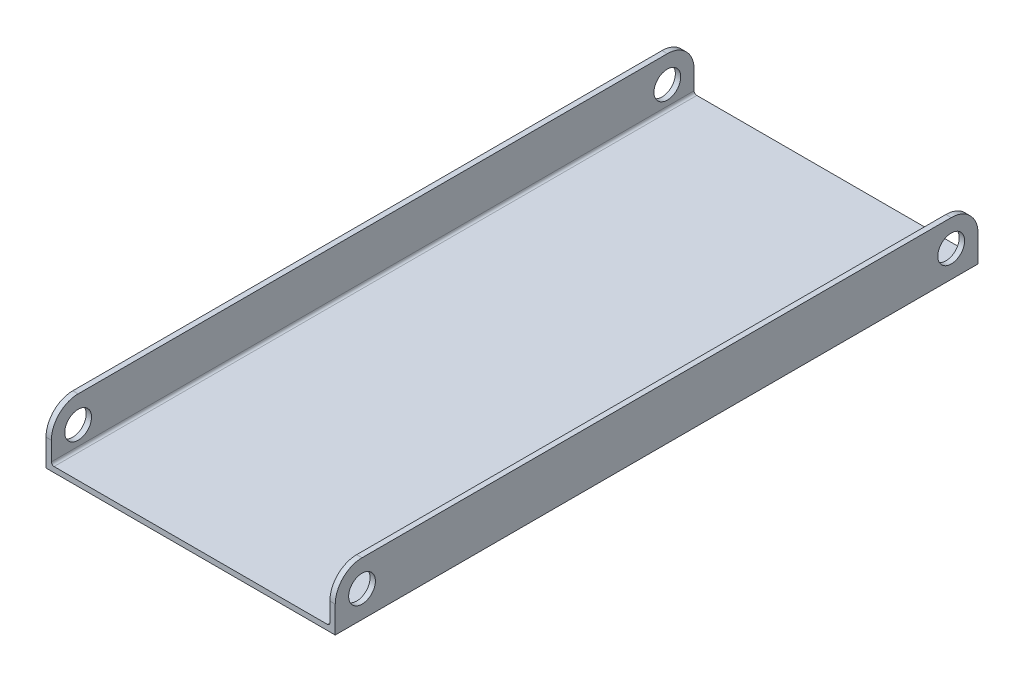
ISO-10303-21;
HEADER;
FILE_DESCRIPTION(('STEP AP214'),'2;1');
FILE_NAME('part.step','',(''),(''),'','','');
FILE_SCHEMA(('AUTOMOTIVE_DESIGN { 1 0 10303 214 1 1 1 1 }'));
ENDSEC;
DATA;
#1=APPLICATION_CONTEXT('core data for automotive mechanical design processes');
#2=APPLICATION_PROTOCOL_DEFINITION('international standard','automotive_design',2000,#1);
#3=PRODUCT_CONTEXT('',#1,'mechanical');
#4=PRODUCT('Part','Part','',(#3));
#5=PRODUCT_RELATED_PRODUCT_CATEGORY('part','',(#4));
#6=PRODUCT_DEFINITION_FORMATION('','',#4);
#7=PRODUCT_DEFINITION_CONTEXT('part definition',#1,'design');
#8=PRODUCT_DEFINITION('design','',#6,#7);
#9=PRODUCT_DEFINITION_SHAPE('','',#8);
#10=(LENGTH_UNIT() NAMED_UNIT(*) SI_UNIT(.MILLI.,.METRE.));
#11=(NAMED_UNIT(*) PLANE_ANGLE_UNIT() SI_UNIT($,.RADIAN.));
#12=(NAMED_UNIT(*) SI_UNIT($,.STERADIAN.) SOLID_ANGLE_UNIT());
#13=UNCERTAINTY_MEASURE_WITH_UNIT(LENGTH_MEASURE(1.E-05),#10,'distance_accuracy_value','');
#14=(GEOMETRIC_REPRESENTATION_CONTEXT(3) GLOBAL_UNCERTAINTY_ASSIGNED_CONTEXT((#13)) GLOBAL_UNIT_ASSIGNED_CONTEXT((#10,
#11,#12)) REPRESENTATION_CONTEXT('',''));
#15=CARTESIAN_POINT('',(0.,0.,0.));
#16=DIRECTION('',(0.,0.,1.));
#17=DIRECTION('',(1.,0.,0.));
#18=AXIS2_PLACEMENT_3D('',#15,#16,#17);
#19=CARTESIAN_POINT('',(0.,12.7,-152.4));
#20=DIRECTION('',(1.,0.,0.));
#21=DIRECTION('',(0.,1.,0.));
#22=AXIS2_PLACEMENT_3D('',#19,#20,#21);
#23=PLANE('',#22);
#24=CARTESIAN_POINT('',(0.,6.35,-6.35));
#25=DIRECTION('',(1.,0.,0.));
#26=DIRECTION('',(0.,1.,0.));
#27=AXIS2_PLACEMENT_3D('',#24,#25,#26);
#28=CIRCLE('',#27,3.175);
#29=CARTESIAN_POINT('',(0.,9.525,-6.35));
#30=VERTEX_POINT('',#29);
#31=EDGE_CURVE('E291',#30,#30,#28,.T.);
#32=ORIENTED_EDGE('',*,*,#31,.F.);
#33=EDGE_LOOP('',(#32));
#34=FACE_BOUND('',#33,.T.);
#35=CARTESIAN_POINT('',(0.,6.35,-146.05));
#36=DIRECTION('',(1.,0.,0.));
#37=DIRECTION('',(0.,1.,0.));
#38=AXIS2_PLACEMENT_3D('',#35,#36,#37);
#39=CIRCLE('',#38,3.175);
#40=CARTESIAN_POINT('',(0.,9.525,-146.05));
#41=VERTEX_POINT('',#40);
#42=EDGE_CURVE('E300',#41,#41,#39,.T.);
#43=ORIENTED_EDGE('',*,*,#42,.F.);
#44=EDGE_LOOP('',(#43));
#45=FACE_BOUND('',#44,.T.);
#46=DIRECTION('',(0.,1.,0.));
#47=VECTOR('',#46,1.);
#48=CARTESIAN_POINT('',(0.,12.7,-152.4));
#49=LINE('',#48,#47);
#50=CARTESIAN_POINT('',(0.,0.,-152.4));
#51=VERTEX_POINT('',#50);
#52=CARTESIAN_POINT('',(0.,6.35,-152.4));
#53=VERTEX_POINT('',#52);
#54=EDGE_CURVE('E176',#51,#53,#49,.T.);
#55=ORIENTED_EDGE('',*,*,#54,.T.);
#56=CARTESIAN_POINT('',(0.,6.35,-146.05));
#57=DIRECTION('',(1.,0.,0.));
#58=DIRECTION('',(0.,1.,0.));
#59=AXIS2_PLACEMENT_3D('',#56,#57,#58);
#60=CIRCLE('',#59,6.35);
#61=CARTESIAN_POINT('',(0.,12.7,-146.05));
#62=VERTEX_POINT('',#61);
#63=EDGE_CURVE('E282',#53,#62,#60,.T.);
#64=ORIENTED_EDGE('',*,*,#63,.T.);
#65=DIRECTION('',(0.,0.,1.));
#66=VECTOR('',#65,1.);
#67=CARTESIAN_POINT('',(0.,12.7,-152.4));
#68=LINE('',#67,#66);
#69=CARTESIAN_POINT('',(0.,12.7,-6.35000000000005));
#70=VERTEX_POINT('',#69);
#71=EDGE_CURVE('E178',#62,#70,#68,.T.);
#72=ORIENTED_EDGE('',*,*,#71,.T.);
#73=CARTESIAN_POINT('',(0.,6.35,-6.35));
#74=DIRECTION('',(1.,0.,0.));
#75=DIRECTION('',(0.,1.,0.));
#76=AXIS2_PLACEMENT_3D('',#73,#74,#75);
#77=CIRCLE('',#76,6.35);
#78=CARTESIAN_POINT('',(0.,6.35,0.));
#79=VERTEX_POINT('',#78);
#80=EDGE_CURVE('E61',#70,#79,#77,.T.);
#81=ORIENTED_EDGE('',*,*,#80,.T.);
#82=DIRECTION('',(0.,1.,0.));
#83=VECTOR('',#82,1.);
#84=CARTESIAN_POINT('',(0.,12.7,0.));
#85=LINE('',#84,#83);
#86=CARTESIAN_POINT('',(0.,0.,0.));
#87=VERTEX_POINT('',#86);
#88=EDGE_CURVE('E185',#87,#79,#85,.T.);
#89=ORIENTED_EDGE('',*,*,#88,.F.);
#90=DIRECTION('',(0.,0.,1.));
#91=VECTOR('',#90,1.);
#92=CARTESIAN_POINT('',(0.,0.,-152.4));
#93=LINE('',#92,#91);
#94=EDGE_CURVE('E170',#51,#87,#93,.T.);
#95=ORIENTED_EDGE('',*,*,#94,.F.);
#96=EDGE_LOOP('',(#55,#64,#72,#81,#89,#95));
#97=FACE_BOUND('',#96,.T.);
#98=ADVANCED_FACE('F43',(#34,#45,#97),#23,.T.);
#99=CARTESIAN_POINT('',(0.,0.,-152.4));
#100=DIRECTION('',(0.,-1.,0.));
#101=DIRECTION('',(0.,0.,-1.));
#102=AXIS2_PLACEMENT_3D('',#99,#100,#101);
#103=PLANE('',#102);
#104=DIRECTION('',(1.,0.,0.));
#105=VECTOR('',#104,1.);
#106=CARTESIAN_POINT('',(0.,0.,0.));
#107=LINE('',#106,#105);
#108=CARTESIAN_POINT('',(-68.58,0.,0.));
#109=VERTEX_POINT('',#108);
#110=EDGE_CURVE('E168',#109,#87,#107,.T.);
#111=ORIENTED_EDGE('',*,*,#110,.F.);
#112=DIRECTION('',(0.,0.,1.));
#113=VECTOR('',#112,1.);
#114=CARTESIAN_POINT('',(-68.58,0.,-152.4));
#115=LINE('',#114,#113);
#116=CARTESIAN_POINT('',(-68.58,0.,-152.4));
#117=VERTEX_POINT('',#116);
#118=EDGE_CURVE('E154',#117,#109,#115,.T.);
#119=ORIENTED_EDGE('',*,*,#118,.F.);
#120=DIRECTION('',(1.,0.,0.));
#121=VECTOR('',#120,1.);
#122=CARTESIAN_POINT('',(0.,0.,-152.4));
#123=LINE('',#122,#121);
#124=EDGE_CURVE('E161',#117,#51,#123,.T.);
#125=ORIENTED_EDGE('',*,*,#124,.T.);
#126=ORIENTED_EDGE('',*,*,#94,.T.);
#127=EDGE_LOOP('',(#111,#119,#125,#126));
#128=FACE_BOUND('',#127,.T.);
#129=ADVANCED_FACE('F166',(#128),#103,.T.);
#130=CARTESIAN_POINT('',(-68.58,0.,-152.4));
#131=DIRECTION('',(-1.,0.,0.));
#132=DIRECTION('',(0.,0.,1.));
#133=AXIS2_PLACEMENT_3D('',#130,#131,#132);
#134=PLANE('',#133);
#135=CARTESIAN_POINT('',(-68.58,6.35,-6.35));
#136=DIRECTION('',(-1.,0.,0.));
#137=DIRECTION('',(0.,0.,1.));
#138=AXIS2_PLACEMENT_3D('',#135,#136,#137);
#139=CIRCLE('',#138,3.175);
#140=CARTESIAN_POINT('',(-68.58,9.525,-6.35));
#141=VERTEX_POINT('',#140);
#142=EDGE_CURVE('E189',#141,#141,#139,.T.);
#143=ORIENTED_EDGE('',*,*,#142,.F.);
#144=EDGE_LOOP('',(#143));
#145=FACE_BOUND('',#144,.T.);
#146=CARTESIAN_POINT('',(-68.58,6.35,-146.05));
#147=DIRECTION('',(-1.,0.,0.));
#148=DIRECTION('',(0.,0.,1.));
#149=AXIS2_PLACEMENT_3D('',#146,#147,#148);
#150=CIRCLE('',#149,3.175);
#151=CARTESIAN_POINT('',(-68.58,9.525,-146.05));
#152=VERTEX_POINT('',#151);
#153=EDGE_CURVE('E297',#152,#152,#150,.T.);
#154=ORIENTED_EDGE('',*,*,#153,.F.);
#155=EDGE_LOOP('',(#154));
#156=FACE_BOUND('',#155,.T.);
#157=DIRECTION('',(0.,0.,1.));
#158=VECTOR('',#157,1.);
#159=CARTESIAN_POINT('',(-68.58,12.7,-152.4));
#160=LINE('',#159,#158);
#161=CARTESIAN_POINT('',(-68.58,12.7,-146.05));
#162=VERTEX_POINT('',#161);
#163=CARTESIAN_POINT('',(-68.58,12.7,-6.35000000000005));
#164=VERTEX_POINT('',#163);
#165=EDGE_CURVE('E171',#162,#164,#160,.T.);
#166=ORIENTED_EDGE('',*,*,#165,.F.);
#167=CARTESIAN_POINT('',(-68.58,6.35,-146.05));
#168=DIRECTION('',(-1.,0.,0.));
#169=DIRECTION('',(0.,0.,1.));
#170=AXIS2_PLACEMENT_3D('',#167,#168,#169);
#171=CIRCLE('',#170,6.35);
#172=CARTESIAN_POINT('',(-68.58,6.35,-152.4));
#173=VERTEX_POINT('',#172);
#174=EDGE_CURVE('E156',#162,#173,#171,.T.);
#175=ORIENTED_EDGE('',*,*,#174,.T.);
#176=DIRECTION('',(0.,-1.,0.));
#177=VECTOR('',#176,1.);
#178=CARTESIAN_POINT('',(-68.58,0.,-152.4));
#179=LINE('',#178,#177);
#180=EDGE_CURVE('E149',#173,#117,#179,.T.);
#181=ORIENTED_EDGE('',*,*,#180,.T.);
#182=ORIENTED_EDGE('',*,*,#118,.T.);
#183=DIRECTION('',(0.,-1.,0.));
#184=VECTOR('',#183,1.);
#185=CARTESIAN_POINT('',(-68.58,0.,0.));
#186=LINE('',#185,#184);
#187=CARTESIAN_POINT('',(-68.58,6.35,0.));
#188=VERTEX_POINT('',#187);
#189=EDGE_CURVE('E200',#188,#109,#186,.T.);
#190=ORIENTED_EDGE('',*,*,#189,.F.);
#191=CARTESIAN_POINT('',(-68.58,6.35,-6.35));
#192=DIRECTION('',(-1.,0.,0.));
#193=DIRECTION('',(0.,0.,1.));
#194=AXIS2_PLACEMENT_3D('',#191,#192,#193);
#195=CIRCLE('',#194,6.35);
#196=EDGE_CURVE('E251',#188,#164,#195,.T.);
#197=ORIENTED_EDGE('',*,*,#196,.T.);
#198=EDGE_LOOP('',(#166,#175,#181,#182,#190,#197));
#199=FACE_BOUND('',#198,.T.);
#200=ADVANCED_FACE('F152',(#145,#156,#199),#134,.T.);
#201=CARTESIAN_POINT('',(-68.58,12.7,-152.4));
#202=DIRECTION('',(0.,1.,0.));
#203=DIRECTION('',(0.,0.,1.));
#204=AXIS2_PLACEMENT_3D('',#201,#202,#203);
#205=PLANE('',#204);
#206=DIRECTION('',(0.,0.,1.));
#207=VECTOR('',#206,1.);
#208=CARTESIAN_POINT('',(-67.31,12.7,-152.4));
#209=LINE('',#208,#207);
#210=CARTESIAN_POINT('',(-67.31,12.7,-146.05));
#211=VERTEX_POINT('',#210);
#212=CARTESIAN_POINT('',(-67.31,12.7,-6.35000000000005));
#213=VERTEX_POINT('',#212);
#214=EDGE_CURVE('E211',#211,#213,#209,.T.);
#215=ORIENTED_EDGE('',*,*,#214,.F.);
#216=DIRECTION('',(-1.,0.,0.));
#217=VECTOR('',#216,1.);
#218=CARTESIAN_POINT('',(-68.58,12.7,-146.05));
#219=LINE('',#218,#217);
#220=EDGE_CURVE('E247',#211,#162,#219,.T.);
#221=ORIENTED_EDGE('',*,*,#220,.T.);
#222=ORIENTED_EDGE('',*,*,#165,.T.);
#223=DIRECTION('',(-1.,0.,0.));
#224=VECTOR('',#223,1.);
#225=CARTESIAN_POINT('',(-67.31,12.7,-6.35));
#226=LINE('',#225,#224);
#227=EDGE_CURVE('E244',#164,#213,#226,.F.);
#228=ORIENTED_EDGE('',*,*,#227,.T.);
#229=EDGE_LOOP('',(#215,#221,#222,#228));
#230=FACE_BOUND('',#229,.T.);
#231=ADVANCED_FACE('F340',(#230),#205,.T.);
#232=CARTESIAN_POINT('',(-67.31,12.7,-152.4));
#233=DIRECTION('',(1.,0.,0.));
#234=DIRECTION('',(0.,0.,-1.));
#235=AXIS2_PLACEMENT_3D('',#232,#233,#234);
#236=PLANE('',#235);
#237=CARTESIAN_POINT('',(-67.31,6.35,-6.35));
#238=DIRECTION('',(1.,0.,0.));
#239=DIRECTION('',(0.,0.,-1.));
#240=AXIS2_PLACEMENT_3D('',#237,#238,#239);
#241=CIRCLE('',#240,3.175);
#242=CARTESIAN_POINT('',(-67.31,9.525,-6.35));
#243=VERTEX_POINT('',#242);
#244=EDGE_CURVE('E311',#243,#243,#241,.T.);
#245=ORIENTED_EDGE('',*,*,#244,.F.);
#246=EDGE_LOOP('',(#245));
#247=FACE_BOUND('',#246,.T.);
#248=CARTESIAN_POINT('',(-67.31,6.35,-146.05));
#249=DIRECTION('',(1.,0.,0.));
#250=DIRECTION('',(0.,0.,-1.));
#251=AXIS2_PLACEMENT_3D('',#248,#249,#250);
#252=CIRCLE('',#251,3.175);
#253=CARTESIAN_POINT('',(-67.31,9.525,-146.05));
#254=VERTEX_POINT('',#253);
#255=EDGE_CURVE('E290',#254,#254,#252,.T.);
#256=ORIENTED_EDGE('',*,*,#255,.F.);
#257=EDGE_LOOP('',(#256));
#258=FACE_BOUND('',#257,.T.);
#259=DIRECTION('',(0.,1.,0.));
#260=VECTOR('',#259,1.);
#261=CARTESIAN_POINT('',(-67.31,12.7,-152.4));
#262=LINE('',#261,#260);
#263=CARTESIAN_POINT('',(-67.31,1.90499999999999,-152.4));
#264=VERTEX_POINT('',#263);
#265=CARTESIAN_POINT('',(-67.31,6.35,-152.4));
#266=VERTEX_POINT('',#265);
#267=EDGE_CURVE('E162',#264,#266,#262,.T.);
#268=ORIENTED_EDGE('',*,*,#267,.T.);
#269=CARTESIAN_POINT('',(-67.31,6.35,-146.05));
#270=DIRECTION('',(1.,0.,0.));
#271=DIRECTION('',(0.,0.,-1.));
#272=AXIS2_PLACEMENT_3D('',#269,#270,#271);
#273=CIRCLE('',#272,6.35);
#274=EDGE_CURVE('E265',#266,#211,#273,.T.);
#275=ORIENTED_EDGE('',*,*,#274,.T.);
#276=ORIENTED_EDGE('',*,*,#214,.T.);
#277=CARTESIAN_POINT('',(-67.31,6.35,-6.35));
#278=DIRECTION('',(1.,0.,0.));
#279=DIRECTION('',(0.,0.,-1.));
#280=AXIS2_PLACEMENT_3D('',#277,#278,#279);
#281=CIRCLE('',#280,6.35);
#282=CARTESIAN_POINT('',(-67.31,6.35,0.));
#283=VERTEX_POINT('',#282);
#284=EDGE_CURVE('E262',#213,#283,#281,.T.);
#285=ORIENTED_EDGE('',*,*,#284,.T.);
#286=DIRECTION('',(0.,1.,0.));
#287=VECTOR('',#286,1.);
#288=CARTESIAN_POINT('',(-67.31,12.7,0.));
#289=LINE('',#288,#287);
#290=CARTESIAN_POINT('',(-67.31,1.90499999999999,0.));
#291=VERTEX_POINT('',#290);
#292=EDGE_CURVE('E196',#291,#283,#289,.T.);
#293=ORIENTED_EDGE('',*,*,#292,.F.);
#294=DIRECTION('',(0.,0.,1.));
#295=VECTOR('',#294,1.);
#296=CARTESIAN_POINT('',(-67.31,1.90499999999999,-152.4));
#297=LINE('',#296,#295);
#298=EDGE_CURVE('E228',#291,#264,#297,.F.);
#299=ORIENTED_EDGE('',*,*,#298,.T.);
#300=EDGE_LOOP('',(#268,#275,#276,#285,#293,#299));
#301=FACE_BOUND('',#300,.T.);
#302=ADVANCED_FACE('F331',(#247,#258,#301),#236,.T.);
#303=CARTESIAN_POINT('',(-67.31,1.26999999999999,-152.4));
#304=DIRECTION('',(0.,1.,0.));
#305=DIRECTION('',(0.,0.,1.));
#306=AXIS2_PLACEMENT_3D('',#303,#304,#305);
#307=PLANE('',#306);
#308=DIRECTION('',(-1.,0.,0.));
#309=VECTOR('',#308,1.);
#310=CARTESIAN_POINT('',(-67.31,1.26999999999999,0.));
#311=LINE('',#310,#309);
#312=CARTESIAN_POINT('',(-1.90499999999999,1.26999999999999,0.));
#313=VERTEX_POINT('',#312);
#314=CARTESIAN_POINT('',(-66.675,1.26999999999999,0.));
#315=VERTEX_POINT('',#314);
#316=EDGE_CURVE('E192',#313,#315,#311,.T.);
#317=ORIENTED_EDGE('',*,*,#316,.F.);
#318=DIRECTION('',(0.,0.,1.));
#319=VECTOR('',#318,1.);
#320=CARTESIAN_POINT('',(-1.90499999999999,1.26999999999999,-152.4));
#321=LINE('',#320,#319);
#322=CARTESIAN_POINT('',(-1.90499999999999,1.26999999999999,-152.4));
#323=VERTEX_POINT('',#322);
#324=EDGE_CURVE('E225',#313,#323,#321,.F.);
#325=ORIENTED_EDGE('',*,*,#324,.T.);
#326=DIRECTION('',(-1.,0.,0.));
#327=VECTOR('',#326,1.);
#328=CARTESIAN_POINT('',(-67.31,1.26999999999999,-152.4));
#329=LINE('',#328,#327);
#330=CARTESIAN_POINT('',(-66.675,1.26999999999999,-152.4));
#331=VERTEX_POINT('',#330);
#332=EDGE_CURVE('E323',#323,#331,#329,.T.);
#333=ORIENTED_EDGE('',*,*,#332,.T.);
#334=DIRECTION('',(0.,0.,1.));
#335=VECTOR('',#334,1.);
#336=CARTESIAN_POINT('',(-66.675,1.26999999999999,0.));
#337=LINE('',#336,#335);
#338=EDGE_CURVE('E221',#331,#315,#337,.T.);
#339=ORIENTED_EDGE('',*,*,#338,.T.);
#340=EDGE_LOOP('',(#317,#325,#333,#339));
#341=FACE_BOUND('',#340,.T.);
#342=ADVANCED_FACE('F354',(#341),#307,.T.);
#343=CARTESIAN_POINT('',(-1.26999999999999,1.26999999999999,-152.4));
#344=DIRECTION('',(-1.,0.,0.));
#345=DIRECTION('',(0.,0.,1.));
#346=AXIS2_PLACEMENT_3D('',#343,#344,#345);
#347=PLANE('',#346);
#348=CARTESIAN_POINT('',(-1.27000000000002,6.35,-6.35));
#349=DIRECTION('',(-1.,0.,0.));
#350=DIRECTION('',(0.,0.,1.));
#351=AXIS2_PLACEMENT_3D('',#348,#349,#350);
#352=CIRCLE('',#351,3.175);
#353=CARTESIAN_POINT('',(-1.26999999999999,9.525,-6.35));
#354=VERTEX_POINT('',#353);
#355=EDGE_CURVE('E47',#354,#354,#352,.T.);
#356=ORIENTED_EDGE('',*,*,#355,.F.);
#357=EDGE_LOOP('',(#356));
#358=FACE_BOUND('',#357,.T.);
#359=CARTESIAN_POINT('',(-1.27000000000002,6.35,-146.05));
#360=DIRECTION('',(-1.,0.,0.));
#361=DIRECTION('',(0.,0.,1.));
#362=AXIS2_PLACEMENT_3D('',#359,#360,#361);
#363=CIRCLE('',#362,3.175);
#364=CARTESIAN_POINT('',(-1.26999999999999,9.525,-146.05));
#365=VERTEX_POINT('',#364);
#366=EDGE_CURVE('E287',#365,#365,#363,.T.);
#367=ORIENTED_EDGE('',*,*,#366,.F.);
#368=EDGE_LOOP('',(#367));
#369=FACE_BOUND('',#368,.T.);
#370=DIRECTION('',(0.,0.,1.));
#371=VECTOR('',#370,1.);
#372=CARTESIAN_POINT('',(-1.26999999999999,12.7,-152.4));
#373=LINE('',#372,#371);
#374=CARTESIAN_POINT('',(-1.26999999999999,12.7,-146.05));
#375=VERTEX_POINT('',#374);
#376=CARTESIAN_POINT('',(-1.26999999999999,12.7,-6.35000000000005));
#377=VERTEX_POINT('',#376);
#378=EDGE_CURVE('E181',#375,#377,#373,.T.);
#379=ORIENTED_EDGE('',*,*,#378,.F.);
#380=CARTESIAN_POINT('',(-1.26999999999999,6.35,-146.05));
#381=DIRECTION('',(-1.,0.,0.));
#382=DIRECTION('',(0.,0.,1.));
#383=AXIS2_PLACEMENT_3D('',#380,#381,#382);
#384=CIRCLE('',#383,6.35);
#385=CARTESIAN_POINT('',(-1.26999999999999,6.35,-152.4));
#386=VERTEX_POINT('',#385);
#387=EDGE_CURVE('E277',#375,#386,#384,.T.);
#388=ORIENTED_EDGE('',*,*,#387,.T.);
#389=DIRECTION('',(0.,-1.,0.));
#390=VECTOR('',#389,1.);
#391=CARTESIAN_POINT('',(-1.26999999999999,1.26999999999999,-152.4));
#392=LINE('',#391,#390);
#393=CARTESIAN_POINT('',(-1.26999999999999,1.90499999999999,-152.4));
#394=VERTEX_POINT('',#393);
#395=EDGE_CURVE('E320',#386,#394,#392,.T.);
#396=ORIENTED_EDGE('',*,*,#395,.T.);
#397=DIRECTION('',(0.,0.,1.));
#398=VECTOR('',#397,1.);
#399=CARTESIAN_POINT('',(-1.26999999999999,1.90499999999999,0.));
#400=LINE('',#399,#398);
#401=CARTESIAN_POINT('',(-1.26999999999999,1.90499999999999,0.));
#402=VERTEX_POINT('',#401);
#403=EDGE_CURVE('E206',#394,#402,#400,.T.);
#404=ORIENTED_EDGE('',*,*,#403,.T.);
#405=DIRECTION('',(0.,-1.,0.));
#406=VECTOR('',#405,1.);
#407=CARTESIAN_POINT('',(-1.26999999999999,1.26999999999999,0.));
#408=LINE('',#407,#406);
#409=CARTESIAN_POINT('',(-1.26999999999999,6.35,0.));
#410=VERTEX_POINT('',#409);
#411=EDGE_CURVE('E188',#410,#402,#408,.T.);
#412=ORIENTED_EDGE('',*,*,#411,.F.);
#413=CARTESIAN_POINT('',(-1.26999999999999,6.35,-6.35));
#414=DIRECTION('',(-1.,0.,0.));
#415=DIRECTION('',(0.,0.,1.));
#416=AXIS2_PLACEMENT_3D('',#413,#414,#415);
#417=CIRCLE('',#416,6.35);
#418=EDGE_CURVE('E69',#410,#377,#417,.T.);
#419=ORIENTED_EDGE('',*,*,#418,.T.);
#420=EDGE_LOOP('',(#379,#388,#396,#404,#412,#419));
#421=FACE_BOUND('',#420,.T.);
#422=ADVANCED_FACE('F373',(#358,#369,#421),#347,.T.);
#423=CARTESIAN_POINT('',(-1.26999999999999,12.7,-152.4));
#424=DIRECTION('',(0.,1.,0.));
#425=DIRECTION('',(0.,0.,1.));
#426=AXIS2_PLACEMENT_3D('',#423,#424,#425);
#427=PLANE('',#426);
#428=ORIENTED_EDGE('',*,*,#71,.F.);
#429=DIRECTION('',(-1.,0.,0.));
#430=VECTOR('',#429,1.);
#431=CARTESIAN_POINT('',(-1.26999999999999,12.7,-146.05));
#432=LINE('',#431,#430);
#433=EDGE_CURVE('E271',#62,#375,#432,.T.);
#434=ORIENTED_EDGE('',*,*,#433,.T.);
#435=ORIENTED_EDGE('',*,*,#378,.T.);
#436=DIRECTION('',(-1.,0.,0.));
#437=VECTOR('',#436,1.);
#438=CARTESIAN_POINT('',(0.,12.7,-6.35));
#439=LINE('',#438,#437);
#440=EDGE_CURVE('E268',#377,#70,#439,.F.);
#441=ORIENTED_EDGE('',*,*,#440,.T.);
#442=EDGE_LOOP('',(#428,#434,#435,#441));
#443=FACE_BOUND('',#442,.T.);
#444=ADVANCED_FACE('F369',(#443),#427,.T.);
#445=CARTESIAN_POINT('',(0.,0.,-152.4));
#446=DIRECTION('',(0.,0.,-1.));
#447=DIRECTION('',(-1.,0.,0.));
#448=AXIS2_PLACEMENT_3D('',#445,#446,#447);
#449=PLANE('',#448);
#450=ORIENTED_EDGE('',*,*,#180,.F.);
#451=DIRECTION('',(-1.,0.,0.));
#452=VECTOR('',#451,1.);
#453=CARTESIAN_POINT('',(0.,6.35,-152.4));
#454=LINE('',#453,#452);
#455=EDGE_CURVE('E259',#173,#266,#454,.F.);
#456=ORIENTED_EDGE('',*,*,#455,.T.);
#457=ORIENTED_EDGE('',*,*,#267,.F.);
#458=CARTESIAN_POINT('',(-66.675,1.90499999999999,-152.4));
#459=DIRECTION('',(0.,0.,-1.));
#460=DIRECTION('',(-1.,0.,0.));
#461=AXIS2_PLACEMENT_3D('',#458,#459,#460);
#462=CIRCLE('',#461,0.635);
#463=EDGE_CURVE('E241',#264,#331,#462,.F.);
#464=ORIENTED_EDGE('',*,*,#463,.T.);
#465=ORIENTED_EDGE('',*,*,#332,.F.);
#466=CARTESIAN_POINT('',(-1.90499999999999,1.90499999999999,-152.4));
#467=DIRECTION('',(0.,0.,-1.));
#468=DIRECTION('',(-1.,0.,0.));
#469=AXIS2_PLACEMENT_3D('',#466,#467,#468);
#470=CIRCLE('',#469,0.635);
#471=EDGE_CURVE('E234',#323,#394,#470,.F.);
#472=ORIENTED_EDGE('',*,*,#471,.T.);
#473=ORIENTED_EDGE('',*,*,#395,.F.);
#474=DIRECTION('',(-1.,0.,0.));
#475=VECTOR('',#474,1.);
#476=CARTESIAN_POINT('',(0.,6.35,-152.4));
#477=LINE('',#476,#475);
#478=EDGE_CURVE('E256',#386,#53,#477,.F.);
#479=ORIENTED_EDGE('',*,*,#478,.T.);
#480=ORIENTED_EDGE('',*,*,#54,.F.);
#481=ORIENTED_EDGE('',*,*,#124,.F.);
#482=EDGE_LOOP('',(#450,#456,#457,#464,#465,#472,#473,#479,#480,#481));
#483=FACE_BOUND('',#482,.T.);
#484=ADVANCED_FACE('F174',(#483),#449,.T.);
#485=CARTESIAN_POINT('',(0.,0.,0.));
#486=DIRECTION('',(0.,0.,-1.));
#487=DIRECTION('',(-1.,0.,0.));
#488=AXIS2_PLACEMENT_3D('',#485,#486,#487);
#489=PLANE('',#488);
#490=ORIENTED_EDGE('',*,*,#88,.T.);
#491=DIRECTION('',(-1.,0.,0.));
#492=VECTOR('',#491,1.);
#493=CARTESIAN_POINT('',(-1.26999999999999,6.35,0.));
#494=LINE('',#493,#492);
#495=EDGE_CURVE('E11',#79,#410,#494,.T.);
#496=ORIENTED_EDGE('',*,*,#495,.T.);
#497=ORIENTED_EDGE('',*,*,#411,.T.);
#498=CARTESIAN_POINT('',(-1.90499999999999,1.90499999999999,0.));
#499=DIRECTION('',(0.,0.,-1.));
#500=DIRECTION('',(-1.,0.,0.));
#501=AXIS2_PLACEMENT_3D('',#498,#499,#500);
#502=CIRCLE('',#501,0.635);
#503=EDGE_CURVE('E231',#402,#313,#502,.T.);
#504=ORIENTED_EDGE('',*,*,#503,.T.);
#505=ORIENTED_EDGE('',*,*,#316,.T.);
#506=CARTESIAN_POINT('',(-66.675,1.90499999999999,0.));
#507=DIRECTION('',(0.,0.,-1.));
#508=DIRECTION('',(-1.,0.,0.));
#509=AXIS2_PLACEMENT_3D('',#506,#507,#508);
#510=CIRCLE('',#509,0.635);
#511=EDGE_CURVE('E238',#315,#291,#510,.T.);
#512=ORIENTED_EDGE('',*,*,#511,.T.);
#513=ORIENTED_EDGE('',*,*,#292,.T.);
#514=DIRECTION('',(-1.,0.,0.));
#515=VECTOR('',#514,1.);
#516=CARTESIAN_POINT('',(-68.58,6.35,0.));
#517=LINE('',#516,#515);
#518=EDGE_CURVE('E53',#283,#188,#517,.T.);
#519=ORIENTED_EDGE('',*,*,#518,.T.);
#520=ORIENTED_EDGE('',*,*,#189,.T.);
#521=ORIENTED_EDGE('',*,*,#110,.T.);
#522=EDGE_LOOP('',(#490,#496,#497,#504,#505,#512,#513,#519,#520,#521));
#523=FACE_BOUND('',#522,.T.);
#524=ADVANCED_FACE('F346',(#523),#489,.F.);
#525=CARTESIAN_POINT('',(-1.90499999999999,1.90499999999999,-152.4));
#526=DIRECTION('',(0.,0.,-1.));
#527=DIRECTION('',(-1.,0.,0.));
#528=AXIS2_PLACEMENT_3D('',#525,#526,#527);
#529=CYLINDRICAL_SURFACE('',#528,0.635);
#530=ORIENTED_EDGE('',*,*,#471,.F.);
#531=ORIENTED_EDGE('',*,*,#324,.F.);
#532=ORIENTED_EDGE('',*,*,#503,.F.);
#533=ORIENTED_EDGE('',*,*,#403,.F.);
#534=EDGE_LOOP('',(#530,#531,#532,#533));
#535=FACE_BOUND('',#534,.T.);
#536=ADVANCED_FACE('F358',(#535),#529,.F.);
#537=CARTESIAN_POINT('',(-66.675,1.90499999999999,-152.4));
#538=DIRECTION('',(0.,0.,-1.));
#539=DIRECTION('',(-1.,0.,0.));
#540=AXIS2_PLACEMENT_3D('',#537,#538,#539);
#541=CYLINDRICAL_SURFACE('',#540,0.635);
#542=ORIENTED_EDGE('',*,*,#463,.F.);
#543=ORIENTED_EDGE('',*,*,#298,.F.);
#544=ORIENTED_EDGE('',*,*,#511,.F.);
#545=ORIENTED_EDGE('',*,*,#338,.F.);
#546=EDGE_LOOP('',(#542,#543,#544,#545));
#547=FACE_BOUND('',#546,.T.);
#548=ADVANCED_FACE('F348',(#547),#541,.F.);
#549=CARTESIAN_POINT('',(-68.58,6.35,-146.05));
#550=DIRECTION('',(-1.,0.,0.));
#551=DIRECTION('',(0.,0.,1.));
#552=AXIS2_PLACEMENT_3D('',#549,#550,#551);
#553=CYLINDRICAL_SURFACE('',#552,6.35);
#554=ORIENTED_EDGE('',*,*,#274,.F.);
#555=ORIENTED_EDGE('',*,*,#455,.F.);
#556=ORIENTED_EDGE('',*,*,#174,.F.);
#557=ORIENTED_EDGE('',*,*,#220,.F.);
#558=EDGE_LOOP('',(#554,#555,#556,#557));
#559=FACE_BOUND('',#558,.T.);
#560=ADVANCED_FACE('F338',(#559),#553,.T.);
#561=CARTESIAN_POINT('',(-1.26999999999999,6.35,-146.05));
#562=DIRECTION('',(-1.,0.,0.));
#563=DIRECTION('',(0.,0.,1.));
#564=AXIS2_PLACEMENT_3D('',#561,#562,#563);
#565=CYLINDRICAL_SURFACE('',#564,6.35);
#566=ORIENTED_EDGE('',*,*,#63,.F.);
#567=ORIENTED_EDGE('',*,*,#478,.F.);
#568=ORIENTED_EDGE('',*,*,#387,.F.);
#569=ORIENTED_EDGE('',*,*,#433,.F.);
#570=EDGE_LOOP('',(#566,#567,#568,#569));
#571=FACE_BOUND('',#570,.T.);
#572=ADVANCED_FACE('F365',(#571),#565,.T.);
#573=CARTESIAN_POINT('',(0.,6.35,-6.35));
#574=DIRECTION('',(1.,0.,0.));
#575=DIRECTION('',(0.,0.,-1.));
#576=AXIS2_PLACEMENT_3D('',#573,#574,#575);
#577=CYLINDRICAL_SURFACE('',#576,6.35);
#578=ORIENTED_EDGE('',*,*,#80,.F.);
#579=ORIENTED_EDGE('',*,*,#440,.F.);
#580=ORIENTED_EDGE('',*,*,#418,.F.);
#581=ORIENTED_EDGE('',*,*,#495,.F.);
#582=EDGE_LOOP('',(#578,#579,#580,#581));
#583=FACE_BOUND('',#582,.T.);
#584=ADVANCED_FACE('F371',(#583),#577,.T.);
#585=CARTESIAN_POINT('',(0.,6.35,-6.35));
#586=DIRECTION('',(1.,0.,0.));
#587=DIRECTION('',(0.,0.,-1.));
#588=AXIS2_PLACEMENT_3D('',#585,#586,#587);
#589=CYLINDRICAL_SURFACE('',#588,6.35);
#590=ORIENTED_EDGE('',*,*,#284,.F.);
#591=ORIENTED_EDGE('',*,*,#227,.F.);
#592=ORIENTED_EDGE('',*,*,#196,.F.);
#593=ORIENTED_EDGE('',*,*,#518,.F.);
#594=EDGE_LOOP('',(#590,#591,#592,#593));
#595=FACE_BOUND('',#594,.T.);
#596=ADVANCED_FACE('F45',(#595),#589,.T.);
#597=CARTESIAN_POINT('',(-152.4,6.34999999999999,-146.05));
#598=DIRECTION('',(1.,0.,0.));
#599=DIRECTION('',(0.,1.,0.));
#600=AXIS2_PLACEMENT_3D('',#597,#598,#599);
#601=CYLINDRICAL_SURFACE('',#600,3.175);
#602=CARTESIAN_POINT('',(-1.26999999999999,9.525,-146.05));
#603=CARTESIAN_POINT('',(-1.25677083333333,9.525,-146.05));
#604=CARTESIAN_POINT('',(-1.24354166666666,9.525,-146.05));
#605=CARTESIAN_POINT('',(-1.21708333333333,9.525,-146.05));
#606=CARTESIAN_POINT('',(-1.20385416666667,9.525,-146.05));
#607=CARTESIAN_POINT('',(-1.17739583333334,9.525,-146.05));
#608=CARTESIAN_POINT('',(-1.16416666666667,9.525,-146.05));
#609=CARTESIAN_POINT('',(-1.13770833333334,9.525,-146.05));
#610=CARTESIAN_POINT('',(-1.12447916666667,9.525,-146.05));
#611=CARTESIAN_POINT('',(-1.09802083333333,9.525,-146.05));
#612=CARTESIAN_POINT('',(-1.08479166666666,9.525,-146.05));
#613=CARTESIAN_POINT('',(-1.05833333333332,9.525,-146.05));
#614=CARTESIAN_POINT('',(-1.04510416666665,9.525,-146.05));
#615=CARTESIAN_POINT('',(-1.01864583333332,9.525,-146.05));
#616=CARTESIAN_POINT('',(-1.00541666666666,9.525,-146.05));
#617=CARTESIAN_POINT('',(-0.978958333333326,9.525,-146.05));
#618=CARTESIAN_POINT('',(-0.96572916666666,9.525,-146.05));
#619=CARTESIAN_POINT('',(-0.93927083333333,9.525,-146.05));
#620=CARTESIAN_POINT('',(-0.926041666666664,9.525,-146.05));
#621=CARTESIAN_POINT('',(-0.899583333333333,9.525,-146.05));
#622=CARTESIAN_POINT('',(-0.886354166666668,9.525,-146.05));
#623=CARTESIAN_POINT('',(-0.859895833333337,9.525,-146.05));
#624=CARTESIAN_POINT('',(-0.846666666666671,9.525,-146.05));
#625=CARTESIAN_POINT('',(-0.820208333333331,9.525,-146.05));
#626=CARTESIAN_POINT('',(-0.806979166666657,9.525,-146.05));
#627=CARTESIAN_POINT('',(-0.780520833333317,9.525,-146.05));
#628=CARTESIAN_POINT('',(-0.767291666666651,9.525,-146.05));
#629=CARTESIAN_POINT('',(-0.74083333333332,9.525,-146.05));
#630=CARTESIAN_POINT('',(-0.727604166666655,9.525,-146.05));
#631=CARTESIAN_POINT('',(-0.701145833333324,9.525,-146.05));
#632=CARTESIAN_POINT('',(-0.687916666666658,9.525,-146.05));
#633=CARTESIAN_POINT('',(-0.661458333333328,9.525,-146.05));
#634=CARTESIAN_POINT('',(-0.648229166666662,9.525,-146.05));
#635=CARTESIAN_POINT('',(-0.621770833333331,9.525,-146.05));
#636=CARTESIAN_POINT('',(-0.608541666666666,9.525,-146.05));
#637=CARTESIAN_POINT('',(-0.582083333333335,9.525,-146.05));
#638=CARTESIAN_POINT('',(-0.568854166666669,9.525,-146.05));
#639=CARTESIAN_POINT('',(-0.542395833333339,9.525,-146.05));
#640=CARTESIAN_POINT('',(-0.529166666666673,9.525,-146.05));
#641=CARTESIAN_POINT('',(-0.502708333333342,9.525,-146.05));
#642=CARTESIAN_POINT('',(-0.489479166666677,9.525,-146.05));
#643=CARTESIAN_POINT('',(-0.463020833333337,9.525,-146.05));
#644=CARTESIAN_POINT('',(-0.449791666666662,9.525,-146.05));
#645=CARTESIAN_POINT('',(-0.423333333333322,9.525,-146.05));
#646=CARTESIAN_POINT('',(-0.410104166666656,9.525,-146.05));
#647=CARTESIAN_POINT('',(-0.383645833333326,9.525,-146.05));
#648=CARTESIAN_POINT('',(-0.37041666666666,9.525,-146.05));
#649=CARTESIAN_POINT('',(-0.343958333333329,9.525,-146.05));
#650=CARTESIAN_POINT('',(-0.330729166666664,9.525,-146.05));
#651=CARTESIAN_POINT('',(-0.304270833333333,9.525,-146.05));
#652=CARTESIAN_POINT('',(-0.291041666666667,9.525,-146.05));
#653=CARTESIAN_POINT('',(-0.264583333333337,9.525,-146.05));
#654=CARTESIAN_POINT('',(-0.251354166666671,9.525,-146.05));
#655=CARTESIAN_POINT('',(-0.22489583333334,9.525,-146.05));
#656=CARTESIAN_POINT('',(-0.211666666666675,9.525,-146.05));
#657=CARTESIAN_POINT('',(-0.185208333333335,9.525,-146.05));
#658=CARTESIAN_POINT('',(-0.17197916666666,9.525,-146.05));
#659=CARTESIAN_POINT('',(-0.14552083333332,9.525,-146.05));
#660=CARTESIAN_POINT('',(-0.132291666666654,9.525,-146.05));
#661=CARTESIAN_POINT('',(-0.105833333333324,9.525,-146.05));
#662=CARTESIAN_POINT('',(-0.0926041666666581,9.525,-146.05));
#663=CARTESIAN_POINT('',(-0.0661458333333272,9.525,-146.05));
#664=CARTESIAN_POINT('',(-0.0529166666666618,9.525,-146.05));
#665=CARTESIAN_POINT('',(-0.0264583333333309,9.525,-146.05));
#666=CARTESIAN_POINT('',(-0.0132291666666655,9.525,-146.05));
#667=CARTESIAN_POINT('',(0.,9.525,-146.05));
#668=B_SPLINE_CURVE_WITH_KNOTS('',3,(#602,#603,#604,#605,#606,#607,#608,#609,#610,#611,#612,
#613,#614,#615,#616,#617,#618,#619,#620,#621,#622,#623,#624,#625,#626,#627,#628,#629,#630,#631,
#632,#633,#634,#635,#636,#637,#638,#639,#640,#641,#642,#643,#644,#645,#646,#647,#648,#649,#650,
#651,#652,#653,#654,#655,#656,#657,#658,#659,#660,#661,#662,#663,#664,#665,#666,#667),
.UNSPECIFIED.,.F.,.F.,(4,2,2,2,2,2,2,2,2,2,2,2,2,2,2,2,2,2,2,2,2,2,2,2,2,2,2,2,2,2,2,2,4),(0.,
0.0396874999999963,0.0793749999999926,0.119062499999989,0.158749999999985,0.198437500000009,
0.238125000000006,0.277812500000002,0.317499999999998,0.357187499999995,0.396874999999991,
0.436562499999987,0.476250000000011,0.515937500000008,0.555625000000004,0.5953125,
0.634999999999997,0.674687499999993,0.714374999999989,0.754062499999986,0.793749999999982,
0.833437500000006,0.873125000000002,0.912812499999999,0.952499999999995,0.992187499999991,
1.03187499999999,1.07156249999998,1.11125000000001,1.1509375,1.190625,1.2303125,
1.26999999999999),.UNSPECIFIED.);
#669=EDGE_CURVE('BSEAM405',#365,#41,#668,.T.);
#670=ORIENTED_EDGE('',*,*,#366,.T.);
#671=ORIENTED_EDGE('',*,*,#42,.T.);
#672=ORIENTED_EDGE('',*,*,#669,.T.);
#673=ORIENTED_EDGE('',*,*,#669,.F.);
#674=EDGE_LOOP('',(#670,#672,#671,#673));
#675=FACE_BOUND('',#674,.T.);
#676=ADVANCED_FACE('F405',(#675),#601,.F.);
#677=CARTESIAN_POINT('',(-152.4,6.34999999999999,-6.35));
#678=DIRECTION('',(1.,0.,0.));
#679=DIRECTION('',(0.,1.,0.));
#680=AXIS2_PLACEMENT_3D('',#677,#678,#679);
#681=CYLINDRICAL_SURFACE('',#680,3.175);
#682=CARTESIAN_POINT('',(-1.26999999999999,9.525,-6.35));
#683=CARTESIAN_POINT('',(-1.25677083333333,9.525,-6.35));
#684=CARTESIAN_POINT('',(-1.24354166666666,9.525,-6.35));
#685=CARTESIAN_POINT('',(-1.21708333333333,9.525,-6.35));
#686=CARTESIAN_POINT('',(-1.20385416666667,9.525,-6.35));
#687=CARTESIAN_POINT('',(-1.17739583333334,9.525,-6.35));
#688=CARTESIAN_POINT('',(-1.16416666666667,9.525,-6.35));
#689=CARTESIAN_POINT('',(-1.13770833333334,9.525,-6.35));
#690=CARTESIAN_POINT('',(-1.12447916666667,9.525,-6.35));
#691=CARTESIAN_POINT('',(-1.09802083333333,9.525,-6.35));
#692=CARTESIAN_POINT('',(-1.08479166666666,9.525,-6.35));
#693=CARTESIAN_POINT('',(-1.05833333333332,9.525,-6.35));
#694=CARTESIAN_POINT('',(-1.04510416666665,9.525,-6.35));
#695=CARTESIAN_POINT('',(-1.01864583333332,9.525,-6.35));
#696=CARTESIAN_POINT('',(-1.00541666666666,9.525,-6.35));
#697=CARTESIAN_POINT('',(-0.978958333333326,9.525,-6.35));
#698=CARTESIAN_POINT('',(-0.96572916666666,9.525,-6.35));
#699=CARTESIAN_POINT('',(-0.93927083333333,9.525,-6.35));
#700=CARTESIAN_POINT('',(-0.926041666666664,9.525,-6.35));
#701=CARTESIAN_POINT('',(-0.899583333333333,9.525,-6.35));
#702=CARTESIAN_POINT('',(-0.886354166666668,9.525,-6.35));
#703=CARTESIAN_POINT('',(-0.859895833333337,9.525,-6.35));
#704=CARTESIAN_POINT('',(-0.846666666666671,9.525,-6.35));
#705=CARTESIAN_POINT('',(-0.820208333333331,9.525,-6.35));
#706=CARTESIAN_POINT('',(-0.806979166666657,9.525,-6.35));
#707=CARTESIAN_POINT('',(-0.780520833333317,9.525,-6.35));
#708=CARTESIAN_POINT('',(-0.767291666666651,9.525,-6.35));
#709=CARTESIAN_POINT('',(-0.74083333333332,9.525,-6.35));
#710=CARTESIAN_POINT('',(-0.727604166666655,9.525,-6.35));
#711=CARTESIAN_POINT('',(-0.701145833333324,9.525,-6.35));
#712=CARTESIAN_POINT('',(-0.687916666666658,9.525,-6.35));
#713=CARTESIAN_POINT('',(-0.661458333333328,9.525,-6.35));
#714=CARTESIAN_POINT('',(-0.648229166666662,9.525,-6.35));
#715=CARTESIAN_POINT('',(-0.621770833333331,9.525,-6.35));
#716=CARTESIAN_POINT('',(-0.608541666666666,9.525,-6.35));
#717=CARTESIAN_POINT('',(-0.582083333333335,9.525,-6.35));
#718=CARTESIAN_POINT('',(-0.568854166666669,9.525,-6.35));
#719=CARTESIAN_POINT('',(-0.542395833333339,9.525,-6.35));
#720=CARTESIAN_POINT('',(-0.529166666666673,9.525,-6.35));
#721=CARTESIAN_POINT('',(-0.502708333333342,9.525,-6.35));
#722=CARTESIAN_POINT('',(-0.489479166666677,9.525,-6.35));
#723=CARTESIAN_POINT('',(-0.463020833333337,9.525,-6.35));
#724=CARTESIAN_POINT('',(-0.449791666666662,9.525,-6.35));
#725=CARTESIAN_POINT('',(-0.423333333333322,9.525,-6.35));
#726=CARTESIAN_POINT('',(-0.410104166666656,9.525,-6.35));
#727=CARTESIAN_POINT('',(-0.383645833333326,9.525,-6.35));
#728=CARTESIAN_POINT('',(-0.37041666666666,9.525,-6.35));
#729=CARTESIAN_POINT('',(-0.343958333333329,9.525,-6.35));
#730=CARTESIAN_POINT('',(-0.330729166666664,9.525,-6.35));
#731=CARTESIAN_POINT('',(-0.304270833333333,9.525,-6.35));
#732=CARTESIAN_POINT('',(-0.291041666666667,9.525,-6.35));
#733=CARTESIAN_POINT('',(-0.264583333333337,9.525,-6.35));
#734=CARTESIAN_POINT('',(-0.251354166666671,9.525,-6.35));
#735=CARTESIAN_POINT('',(-0.22489583333334,9.525,-6.35));
#736=CARTESIAN_POINT('',(-0.211666666666675,9.525,-6.35));
#737=CARTESIAN_POINT('',(-0.185208333333335,9.525,-6.35));
#738=CARTESIAN_POINT('',(-0.17197916666666,9.525,-6.35));
#739=CARTESIAN_POINT('',(-0.14552083333332,9.525,-6.35));
#740=CARTESIAN_POINT('',(-0.132291666666654,9.525,-6.35));
#741=CARTESIAN_POINT('',(-0.105833333333324,9.525,-6.35));
#742=CARTESIAN_POINT('',(-0.0926041666666581,9.525,-6.35));
#743=CARTESIAN_POINT('',(-0.0661458333333272,9.525,-6.35));
#744=CARTESIAN_POINT('',(-0.0529166666666618,9.525,-6.35));
#745=CARTESIAN_POINT('',(-0.0264583333333309,9.525,-6.35));
#746=CARTESIAN_POINT('',(-0.0132291666666655,9.525,-6.35));
#747=CARTESIAN_POINT('',(0.,9.525,-6.35));
#748=B_SPLINE_CURVE_WITH_KNOTS('',3,(#682,#683,#684,#685,#686,#687,#688,#689,#690,#691,#692,
#693,#694,#695,#696,#697,#698,#699,#700,#701,#702,#703,#704,#705,#706,#707,#708,#709,#710,#711,
#712,#713,#714,#715,#716,#717,#718,#719,#720,#721,#722,#723,#724,#725,#726,#727,#728,#729,#730,
#731,#732,#733,#734,#735,#736,#737,#738,#739,#740,#741,#742,#743,#744,#745,#746,#747),
.UNSPECIFIED.,.F.,.F.,(4,2,2,2,2,2,2,2,2,2,2,2,2,2,2,2,2,2,2,2,2,2,2,2,2,2,2,2,2,2,2,2,4),(0.,
0.0396874999999963,0.0793749999999926,0.119062499999989,0.158749999999985,0.198437500000009,
0.238125000000006,0.277812500000002,0.317499999999998,0.357187499999995,0.396874999999991,
0.436562499999987,0.476250000000011,0.515937500000008,0.555625000000004,0.5953125,
0.634999999999997,0.674687499999993,0.714374999999989,0.754062499999986,0.793749999999982,
0.833437500000006,0.873125000000002,0.912812499999999,0.952499999999995,0.992187499999991,
1.03187499999999,1.07156249999998,1.11125000000001,1.1509375,1.190625,1.2303125,
1.26999999999999),.UNSPECIFIED.);
#749=EDGE_CURVE('BSEAM409',#354,#30,#748,.T.);
#750=ORIENTED_EDGE('',*,*,#355,.T.);
#751=ORIENTED_EDGE('',*,*,#31,.T.);
#752=ORIENTED_EDGE('',*,*,#749,.T.);
#753=ORIENTED_EDGE('',*,*,#749,.F.);
#754=EDGE_LOOP('',(#750,#752,#751,#753));
#755=FACE_BOUND('',#754,.T.);
#756=ADVANCED_FACE('F409',(#755),#681,.F.);
#757=CARTESIAN_POINT('',(-68.58,9.525,-146.05));
#758=CARTESIAN_POINT('',(-68.5667708333334,9.525,-146.05));
#759=CARTESIAN_POINT('',(-68.5535416666667,9.525,-146.05));
#760=CARTESIAN_POINT('',(-68.5270833333334,9.525,-146.05));
#761=CARTESIAN_POINT('',(-68.5138541666667,9.525,-146.05));
#762=CARTESIAN_POINT('',(-68.4873958333334,9.525,-146.05));
#763=CARTESIAN_POINT('',(-68.4741666666667,9.525,-146.05));
#764=CARTESIAN_POINT('',(-68.4477083333333,9.525,-146.05));
#765=CARTESIAN_POINT('',(-68.4344791666667,9.525,-146.05));
#766=CARTESIAN_POINT('',(-68.4080208333334,9.525,-146.05));
#767=CARTESIAN_POINT('',(-68.3947916666667,9.525,-146.05));
#768=CARTESIAN_POINT('',(-68.3683333333334,9.525,-146.05));
#769=CARTESIAN_POINT('',(-68.3551041666667,9.525,-146.05));
#770=CARTESIAN_POINT('',(-68.3286458333333,9.525,-146.05));
#771=CARTESIAN_POINT('',(-68.3154166666667,9.525,-146.05));
#772=CARTESIAN_POINT('',(-68.2889583333333,9.525,-146.05));
#773=CARTESIAN_POINT('',(-68.2757291666667,9.525,-146.05));
#774=CARTESIAN_POINT('',(-68.2492708333333,9.525,-146.05));
#775=CARTESIAN_POINT('',(-68.2360416666667,9.525,-146.05));
#776=CARTESIAN_POINT('',(-68.2095833333334,9.525,-146.05));
#777=CARTESIAN_POINT('',(-68.1963541666667,9.525,-146.05));
#778=CARTESIAN_POINT('',(-68.1698958333334,9.525,-146.05));
#779=CARTESIAN_POINT('',(-68.1566666666667,9.525,-146.05));
#780=CARTESIAN_POINT('',(-68.1302083333333,9.525,-146.05));
#781=CARTESIAN_POINT('',(-68.1169791666667,9.525,-146.05));
#782=CARTESIAN_POINT('',(-68.0905208333333,9.525,-146.05));
#783=CARTESIAN_POINT('',(-68.0772916666667,9.525,-146.05));
#784=CARTESIAN_POINT('',(-68.0508333333334,9.525,-146.05));
#785=CARTESIAN_POINT('',(-68.0376041666667,9.525,-146.05));
#786=CARTESIAN_POINT('',(-68.0111458333333,9.525,-146.05));
#787=CARTESIAN_POINT('',(-67.9979166666667,9.525,-146.05));
#788=CARTESIAN_POINT('',(-67.9714583333333,9.525,-146.05));
#789=CARTESIAN_POINT('',(-67.9582291666667,9.525,-146.05));
#790=CARTESIAN_POINT('',(-67.9317708333333,9.525,-146.05));
#791=CARTESIAN_POINT('',(-67.9185416666667,9.525,-146.05));
#792=CARTESIAN_POINT('',(-67.8920833333333,9.525,-146.05));
#793=CARTESIAN_POINT('',(-67.8788541666667,9.525,-146.05));
#794=CARTESIAN_POINT('',(-67.8523958333334,9.525,-146.05));
#795=CARTESIAN_POINT('',(-67.8391666666667,9.525,-146.05));
#796=CARTESIAN_POINT('',(-67.8127083333333,9.525,-146.05));
#797=CARTESIAN_POINT('',(-67.7994791666667,9.525,-146.05));
#798=CARTESIAN_POINT('',(-67.7730208333333,9.525,-146.05));
#799=CARTESIAN_POINT('',(-67.7597916666667,9.525,-146.05));
#800=CARTESIAN_POINT('',(-67.7333333333333,9.525,-146.05));
#801=CARTESIAN_POINT('',(-67.7201041666667,9.525,-146.05));
#802=CARTESIAN_POINT('',(-67.6936458333333,9.525,-146.05));
#803=CARTESIAN_POINT('',(-67.6804166666667,9.525,-146.05));
#804=CARTESIAN_POINT('',(-67.6539583333333,9.525,-146.05));
#805=CARTESIAN_POINT('',(-67.6407291666667,9.525,-146.05));
#806=CARTESIAN_POINT('',(-67.6142708333334,9.525,-146.05));
#807=CARTESIAN_POINT('',(-67.6010416666667,9.525,-146.05));
#808=CARTESIAN_POINT('',(-67.5745833333334,9.525,-146.05));
#809=CARTESIAN_POINT('',(-67.5613541666667,9.525,-146.05));
#810=CARTESIAN_POINT('',(-67.5348958333334,9.525,-146.05));
#811=CARTESIAN_POINT('',(-67.5216666666667,9.525,-146.05));
#812=CARTESIAN_POINT('',(-67.4952083333334,9.525,-146.05));
#813=CARTESIAN_POINT('',(-67.4819791666667,9.525,-146.05));
#814=CARTESIAN_POINT('',(-67.4555208333334,9.525,-146.05));
#815=CARTESIAN_POINT('',(-67.4422916666667,9.525,-146.05));
#816=CARTESIAN_POINT('',(-67.4158333333334,9.525,-146.05));
#817=CARTESIAN_POINT('',(-67.4026041666667,9.525,-146.05));
#818=CARTESIAN_POINT('',(-67.3761458333333,9.525,-146.05));
#819=CARTESIAN_POINT('',(-67.3629166666667,9.525,-146.05));
#820=CARTESIAN_POINT('',(-67.3364583333334,9.525,-146.05));
#821=CARTESIAN_POINT('',(-67.3232291666667,9.525,-146.05));
#822=CARTESIAN_POINT('',(-67.31,9.525,-146.05));
#823=B_SPLINE_CURVE_WITH_KNOTS('',3,(#757,#758,#759,#760,#761,#762,#763,#764,#765,#766,#767,
#768,#769,#770,#771,#772,#773,#774,#775,#776,#777,#778,#779,#780,#781,#782,#783,#784,#785,#786,
#787,#788,#789,#790,#791,#792,#793,#794,#795,#796,#797,#798,#799,#800,#801,#802,#803,#804,#805,
#806,#807,#808,#809,#810,#811,#812,#813,#814,#815,#816,#817,#818,#819,#820,#821,#822),
.UNSPECIFIED.,.F.,.F.,(4,2,2,2,2,2,2,2,2,2,2,2,2,2,2,2,2,2,2,2,2,2,2,2,2,2,2,2,2,2,2,2,4),(0.,
0.0396874999999963,0.0793749999999926,0.119062500000003,0.158749999999999,0.198437499999995,
0.238125000000006,0.277812500000002,0.317499999999998,0.357187499999995,0.396874999999991,
0.436562500000001,0.476249999999998,0.515937499999994,0.555625000000004,0.5953125,
0.634999999999997,0.674687499999993,0.714374999999989,0.7540625,0.793749999999996,
0.833437499999992,0.873125000000002,0.912812499999999,0.952499999999995,0.992187499999991,
1.03187499999999,1.0715625,1.11124999999999,1.15093749999999,1.190625,1.2303125,
1.26999999999999),.UNSPECIFIED.);
#824=EDGE_CURVE('BSEAM411',#152,#254,#823,.T.);
#825=ORIENTED_EDGE('',*,*,#153,.T.);
#826=ORIENTED_EDGE('',*,*,#255,.T.);
#827=ORIENTED_EDGE('',*,*,#824,.T.);
#828=ORIENTED_EDGE('',*,*,#824,.F.);
#829=EDGE_LOOP('',(#825,#827,#826,#828));
#830=FACE_BOUND('',#829,.T.);
#831=ADVANCED_FACE('F411',(#830),#601,.F.);
#832=CARTESIAN_POINT('',(-68.58,9.525,-6.35));
#833=CARTESIAN_POINT('',(-68.5667708333334,9.525,-6.35));
#834=CARTESIAN_POINT('',(-68.5535416666667,9.525,-6.35));
#835=CARTESIAN_POINT('',(-68.5270833333334,9.525,-6.35));
#836=CARTESIAN_POINT('',(-68.5138541666667,9.525,-6.35));
#837=CARTESIAN_POINT('',(-68.4873958333334,9.525,-6.35));
#838=CARTESIAN_POINT('',(-68.4741666666667,9.525,-6.35));
#839=CARTESIAN_POINT('',(-68.4477083333333,9.525,-6.35));
#840=CARTESIAN_POINT('',(-68.4344791666667,9.525,-6.35));
#841=CARTESIAN_POINT('',(-68.4080208333334,9.525,-6.35));
#842=CARTESIAN_POINT('',(-68.3947916666667,9.525,-6.35));
#843=CARTESIAN_POINT('',(-68.3683333333334,9.525,-6.35));
#844=CARTESIAN_POINT('',(-68.3551041666667,9.525,-6.35));
#845=CARTESIAN_POINT('',(-68.3286458333333,9.525,-6.35));
#846=CARTESIAN_POINT('',(-68.3154166666667,9.525,-6.35));
#847=CARTESIAN_POINT('',(-68.2889583333333,9.525,-6.35));
#848=CARTESIAN_POINT('',(-68.2757291666667,9.525,-6.35));
#849=CARTESIAN_POINT('',(-68.2492708333333,9.525,-6.35));
#850=CARTESIAN_POINT('',(-68.2360416666667,9.525,-6.35));
#851=CARTESIAN_POINT('',(-68.2095833333334,9.525,-6.35));
#852=CARTESIAN_POINT('',(-68.1963541666667,9.525,-6.35));
#853=CARTESIAN_POINT('',(-68.1698958333334,9.525,-6.35));
#854=CARTESIAN_POINT('',(-68.1566666666667,9.525,-6.35));
#855=CARTESIAN_POINT('',(-68.1302083333333,9.525,-6.35));
#856=CARTESIAN_POINT('',(-68.1169791666667,9.525,-6.35));
#857=CARTESIAN_POINT('',(-68.0905208333333,9.525,-6.35));
#858=CARTESIAN_POINT('',(-68.0772916666667,9.525,-6.35));
#859=CARTESIAN_POINT('',(-68.0508333333334,9.525,-6.35));
#860=CARTESIAN_POINT('',(-68.0376041666667,9.525,-6.35));
#861=CARTESIAN_POINT('',(-68.0111458333333,9.525,-6.35));
#862=CARTESIAN_POINT('',(-67.9979166666667,9.525,-6.35));
#863=CARTESIAN_POINT('',(-67.9714583333333,9.525,-6.35));
#864=CARTESIAN_POINT('',(-67.9582291666667,9.525,-6.35));
#865=CARTESIAN_POINT('',(-67.9317708333333,9.525,-6.35));
#866=CARTESIAN_POINT('',(-67.9185416666667,9.525,-6.35));
#867=CARTESIAN_POINT('',(-67.8920833333333,9.525,-6.35));
#868=CARTESIAN_POINT('',(-67.8788541666667,9.525,-6.35));
#869=CARTESIAN_POINT('',(-67.8523958333334,9.525,-6.35));
#870=CARTESIAN_POINT('',(-67.8391666666667,9.525,-6.35));
#871=CARTESIAN_POINT('',(-67.8127083333333,9.525,-6.35));
#872=CARTESIAN_POINT('',(-67.7994791666667,9.525,-6.35));
#873=CARTESIAN_POINT('',(-67.7730208333333,9.525,-6.35));
#874=CARTESIAN_POINT('',(-67.7597916666667,9.525,-6.35));
#875=CARTESIAN_POINT('',(-67.7333333333333,9.525,-6.35));
#876=CARTESIAN_POINT('',(-67.7201041666667,9.525,-6.35));
#877=CARTESIAN_POINT('',(-67.6936458333333,9.525,-6.35));
#878=CARTESIAN_POINT('',(-67.6804166666667,9.525,-6.35));
#879=CARTESIAN_POINT('',(-67.6539583333333,9.525,-6.35));
#880=CARTESIAN_POINT('',(-67.6407291666667,9.525,-6.35));
#881=CARTESIAN_POINT('',(-67.6142708333334,9.525,-6.35));
#882=CARTESIAN_POINT('',(-67.6010416666667,9.525,-6.35));
#883=CARTESIAN_POINT('',(-67.5745833333334,9.525,-6.35));
#884=CARTESIAN_POINT('',(-67.5613541666667,9.525,-6.35));
#885=CARTESIAN_POINT('',(-67.5348958333334,9.525,-6.35));
#886=CARTESIAN_POINT('',(-67.5216666666667,9.525,-6.35));
#887=CARTESIAN_POINT('',(-67.4952083333334,9.525,-6.35));
#888=CARTESIAN_POINT('',(-67.4819791666667,9.525,-6.35));
#889=CARTESIAN_POINT('',(-67.4555208333334,9.525,-6.35));
#890=CARTESIAN_POINT('',(-67.4422916666667,9.525,-6.35));
#891=CARTESIAN_POINT('',(-67.4158333333334,9.525,-6.35));
#892=CARTESIAN_POINT('',(-67.4026041666667,9.525,-6.35));
#893=CARTESIAN_POINT('',(-67.3761458333333,9.525,-6.35));
#894=CARTESIAN_POINT('',(-67.3629166666667,9.525,-6.35));
#895=CARTESIAN_POINT('',(-67.3364583333334,9.525,-6.35));
#896=CARTESIAN_POINT('',(-67.3232291666667,9.525,-6.35));
#897=CARTESIAN_POINT('',(-67.31,9.525,-6.35));
#898=B_SPLINE_CURVE_WITH_KNOTS('',3,(#832,#833,#834,#835,#836,#837,#838,#839,#840,#841,#842,
#843,#844,#845,#846,#847,#848,#849,#850,#851,#852,#853,#854,#855,#856,#857,#858,#859,#860,#861,
#862,#863,#864,#865,#866,#867,#868,#869,#870,#871,#872,#873,#874,#875,#876,#877,#878,#879,#880,
#881,#882,#883,#884,#885,#886,#887,#888,#889,#890,#891,#892,#893,#894,#895,#896,#897),
.UNSPECIFIED.,.F.,.F.,(4,2,2,2,2,2,2,2,2,2,2,2,2,2,2,2,2,2,2,2,2,2,2,2,2,2,2,2,2,2,2,2,4),(0.,
0.0396874999999963,0.0793749999999926,0.119062500000003,0.158749999999999,0.198437499999995,
0.238125000000006,0.277812500000002,0.317499999999998,0.357187499999995,0.396874999999991,
0.436562500000001,0.476249999999998,0.515937499999994,0.555625000000004,0.5953125,
0.634999999999997,0.674687499999993,0.714374999999989,0.7540625,0.793749999999996,
0.833437499999992,0.873125000000002,0.912812499999999,0.952499999999995,0.992187499999991,
1.03187499999999,1.0715625,1.11124999999999,1.15093749999999,1.190625,1.2303125,
1.26999999999999),.UNSPECIFIED.);
#899=EDGE_CURVE('BSEAM417',#141,#243,#898,.T.);
#900=ORIENTED_EDGE('',*,*,#142,.T.);
#901=ORIENTED_EDGE('',*,*,#244,.T.);
#902=ORIENTED_EDGE('',*,*,#899,.T.);
#903=ORIENTED_EDGE('',*,*,#899,.F.);
#904=EDGE_LOOP('',(#900,#902,#901,#903));
#905=FACE_BOUND('',#904,.T.);
#906=ADVANCED_FACE('F417',(#905),#681,.F.);
#907=CLOSED_SHELL('',(#98,#129,#200,#231,#302,#342,#422,#444,#484,#524,#536,#548,#560,#572,#584,
#596,#676,#756,#831,#906));
#908=MANIFOLD_SOLID_BREP('B2',#907);
#909=ADVANCED_BREP_SHAPE_REPRESENTATION('',(#18,#908),#14);
#910=SHAPE_DEFINITION_REPRESENTATION(#9,#909);
ENDSEC;
END-ISO-10303-21;
